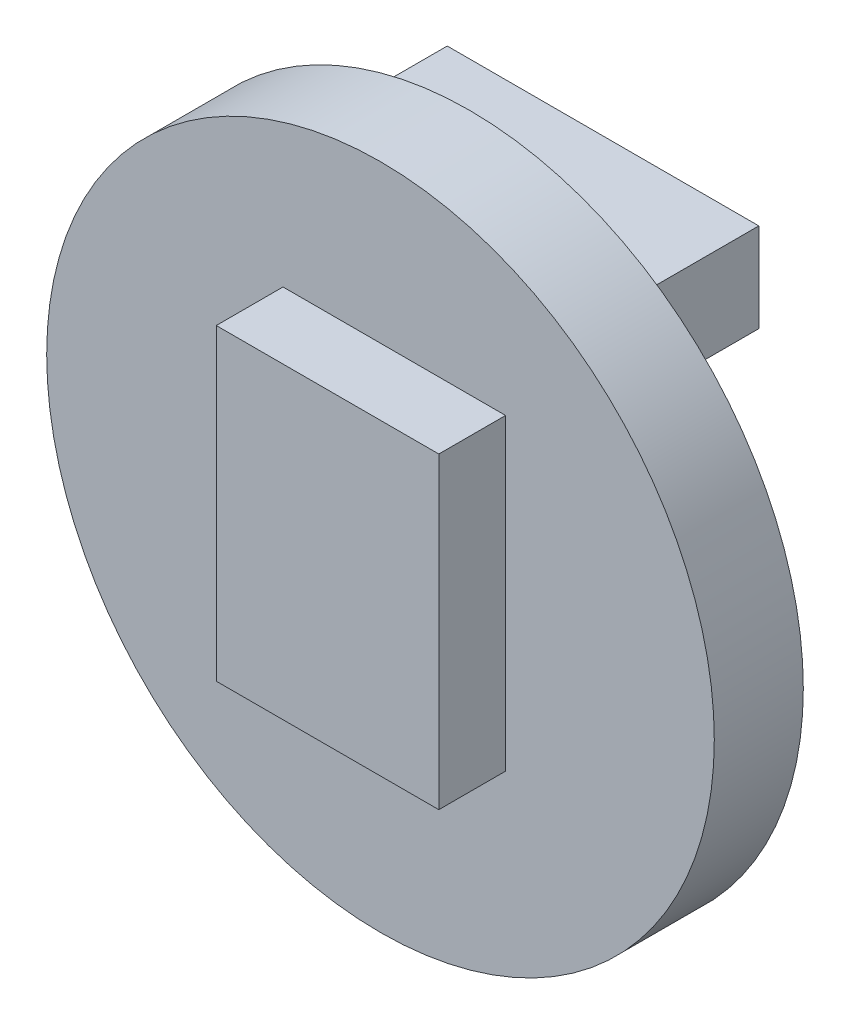
ISO-10303-21;
HEADER;
FILE_DESCRIPTION(('STEP AP214'),'2;1');
FILE_NAME('part.step','',(''),(''),'','','');
FILE_SCHEMA(('AUTOMOTIVE_DESIGN { 1 0 10303 214 1 1 1 1 }'));
ENDSEC;
DATA;
#1=APPLICATION_CONTEXT('core data for automotive mechanical design processes');
#2=APPLICATION_PROTOCOL_DEFINITION('international standard','automotive_design',2000,#1);
#3=PRODUCT_CONTEXT('',#1,'mechanical');
#4=PRODUCT('Part','Part','',(#3));
#5=PRODUCT_RELATED_PRODUCT_CATEGORY('part','',(#4));
#6=PRODUCT_DEFINITION_FORMATION('','',#4);
#7=PRODUCT_DEFINITION_CONTEXT('part definition',#1,'design');
#8=PRODUCT_DEFINITION('design','',#6,#7);
#9=PRODUCT_DEFINITION_SHAPE('','',#8);
#10=(LENGTH_UNIT() NAMED_UNIT(*) SI_UNIT(.MILLI.,.METRE.));
#11=(NAMED_UNIT(*) PLANE_ANGLE_UNIT() SI_UNIT($,.RADIAN.));
#12=(NAMED_UNIT(*) SI_UNIT($,.STERADIAN.) SOLID_ANGLE_UNIT());
#13=UNCERTAINTY_MEASURE_WITH_UNIT(LENGTH_MEASURE(1.E-05),#10,'distance_accuracy_value','');
#14=(GEOMETRIC_REPRESENTATION_CONTEXT(3) GLOBAL_UNCERTAINTY_ASSIGNED_CONTEXT((#13)) GLOBAL_UNIT_ASSIGNED_CONTEXT((#10,
#11,#12)) REPRESENTATION_CONTEXT('',''));
#15=CARTESIAN_POINT('',(0.,0.,0.));
#16=DIRECTION('',(0.,0.,1.));
#17=DIRECTION('',(1.,0.,0.));
#18=AXIS2_PLACEMENT_3D('',#15,#16,#17);
#19=CARTESIAN_POINT('',(0.,0.,0.));
#20=DIRECTION('',(0.,0.,1.));
#21=DIRECTION('',(1.,0.,0.));
#22=AXIS2_PLACEMENT_3D('',#19,#20,#21);
#23=PLANE('',#22);
#24=CARTESIAN_POINT('',(0.,0.,0.));
#25=DIRECTION('',(0.,0.,1.));
#26=DIRECTION('',(1.,0.,0.));
#27=AXIS2_PLACEMENT_3D('',#24,#25,#26);
#28=CIRCLE('',#27,7.5);
#29=CARTESIAN_POINT('',(7.5,0.,0.));
#30=VERTEX_POINT('',#29);
#31=EDGE_CURVE('E35',#30,#30,#28,.T.);
#32=ORIENTED_EDGE('',*,*,#31,.F.);
#33=EDGE_LOOP('',(#32));
#34=FACE_BOUND('',#33,.T.);
#35=DIRECTION('',(0.,1.,0.));
#36=VECTOR('',#35,1.);
#37=CARTESIAN_POINT('',(-3.5,5.5,0.));
#38=LINE('',#37,#36);
#39=CARTESIAN_POINT('',(-3.5,3.5,0.));
#40=VERTEX_POINT('',#39);
#41=CARTESIAN_POINT('',(-3.5,5.5,0.));
#42=VERTEX_POINT('',#41);
#43=EDGE_CURVE('E116',#40,#42,#38,.T.);
#44=ORIENTED_EDGE('',*,*,#43,.F.);
#45=DIRECTION('',(-1.,0.,0.));
#46=VECTOR('',#45,1.);
#47=CARTESIAN_POINT('',(3.5,3.5,0.));
#48=LINE('',#47,#46);
#49=CARTESIAN_POINT('',(3.5,3.5,0.));
#50=VERTEX_POINT('',#49);
#51=EDGE_CURVE('E113',#50,#40,#48,.T.);
#52=ORIENTED_EDGE('',*,*,#51,.F.);
#53=DIRECTION('',(0.,-1.,0.));
#54=VECTOR('',#53,1.);
#55=CARTESIAN_POINT('',(3.5,5.5,0.));
#56=LINE('',#55,#54);
#57=CARTESIAN_POINT('',(3.5,5.5,0.));
#58=VERTEX_POINT('',#57);
#59=EDGE_CURVE('E51',#58,#50,#56,.T.);
#60=ORIENTED_EDGE('',*,*,#59,.F.);
#61=DIRECTION('',(1.,0.,0.));
#62=VECTOR('',#61,1.);
#63=CARTESIAN_POINT('',(3.5,5.5,0.));
#64=LINE('',#63,#62);
#65=EDGE_CURVE('E46',#42,#58,#64,.T.);
#66=ORIENTED_EDGE('',*,*,#65,.F.);
#67=EDGE_LOOP('',(#44,#52,#60,#66));
#68=FACE_BOUND('',#67,.T.);
#69=ADVANCED_FACE('F31',(#34,#68),#23,.F.);
#70=CARTESIAN_POINT('',(0.,0.,2.));
#71=DIRECTION('',(0.,0.,1.));
#72=DIRECTION('',(1.,0.,0.));
#73=AXIS2_PLACEMENT_3D('',#70,#71,#72);
#74=PLANE('',#73);
#75=CARTESIAN_POINT('',(0.,0.,2.));
#76=DIRECTION('',(0.,0.,1.));
#77=DIRECTION('',(1.,0.,0.));
#78=AXIS2_PLACEMENT_3D('',#75,#76,#77);
#79=CIRCLE('',#78,7.5);
#80=CARTESIAN_POINT('',(7.5,0.,2.));
#81=VERTEX_POINT('',#80);
#82=EDGE_CURVE('E11',#81,#81,#79,.T.);
#83=ORIENTED_EDGE('',*,*,#82,.T.);
#84=EDGE_LOOP('',(#83));
#85=FACE_BOUND('',#84,.T.);
#86=DIRECTION('',(-1.,0.,0.));
#87=VECTOR('',#86,1.);
#88=CARTESIAN_POINT('',(-2.1897618838112,3.96647103969272,2.));
#89=LINE('',#88,#87);
#90=CARTESIAN_POINT('',(2.8102381161888,3.96647103969272,2.));
#91=VERTEX_POINT('',#90);
#92=CARTESIAN_POINT('',(-2.1897618838112,3.96647103969272,2.));
#93=VERTEX_POINT('',#92);
#94=EDGE_CURVE('E120',#91,#93,#89,.T.);
#95=ORIENTED_EDGE('',*,*,#94,.F.);
#96=DIRECTION('',(0.,1.,0.));
#97=VECTOR('',#96,1.);
#98=CARTESIAN_POINT('',(2.8102381161888,3.96647103969272,2.));
#99=LINE('',#98,#97);
#100=CARTESIAN_POINT('',(2.8102381161888,-2.95428590822766,2.));
#101=VERTEX_POINT('',#100);
#102=EDGE_CURVE('E117',#101,#91,#99,.T.);
#103=ORIENTED_EDGE('',*,*,#102,.F.);
#104=DIRECTION('',(1.,0.,0.));
#105=VECTOR('',#104,1.);
#106=CARTESIAN_POINT('',(-2.1897618838112,-2.95428590822766,2.));
#107=LINE('',#106,#105);
#108=CARTESIAN_POINT('',(-2.1897618838112,-2.95428590822766,2.));
#109=VERTEX_POINT('',#108);
#110=EDGE_CURVE('E130',#109,#101,#107,.T.);
#111=ORIENTED_EDGE('',*,*,#110,.F.);
#112=DIRECTION('',(0.,-1.,0.));
#113=VECTOR('',#112,1.);
#114=CARTESIAN_POINT('',(-2.1897618838112,3.96647103969272,2.));
#115=LINE('',#114,#113);
#116=EDGE_CURVE('E138',#93,#109,#115,.T.);
#117=ORIENTED_EDGE('',*,*,#116,.F.);
#118=EDGE_LOOP('',(#95,#103,#111,#117));
#119=FACE_BOUND('',#118,.T.);
#120=ADVANCED_FACE('F157',(#85,#119),#74,.T.);
#121=CARTESIAN_POINT('',(0.,0.,2.));
#122=DIRECTION('',(0.,0.,-1.));
#123=DIRECTION('',(-1.,0.,0.));
#124=AXIS2_PLACEMENT_3D('',#121,#122,#123);
#125=CYLINDRICAL_SURFACE('',#124,7.5);
#126=ORIENTED_EDGE('',*,*,#82,.F.);
#127=EDGE_LOOP('',(#126));
#128=FACE_BOUND('',#127,.T.);
#129=ORIENTED_EDGE('',*,*,#31,.T.);
#130=EDGE_LOOP('',(#129));
#131=FACE_BOUND('',#130,.T.);
#132=ADVANCED_FACE('F33',(#128,#131),#125,.T.);
#133=CARTESIAN_POINT('',(2.8102381161888,3.96647103969272,3.5));
#134=DIRECTION('',(-1.,0.,0.));
#135=DIRECTION('',(0.,0.,1.));
#136=AXIS2_PLACEMENT_3D('',#133,#134,#135);
#137=PLANE('',#136);
#138=ORIENTED_EDGE('',*,*,#102,.T.);
#139=DIRECTION('',(0.,0.,-1.));
#140=VECTOR('',#139,1.);
#141=CARTESIAN_POINT('',(2.8102381161888,3.96647103969272,3.5));
#142=LINE('',#141,#140);
#143=CARTESIAN_POINT('',(2.8102381161888,3.96647103969272,3.5));
#144=VERTEX_POINT('',#143);
#145=EDGE_CURVE('E149',#144,#91,#142,.T.);
#146=ORIENTED_EDGE('',*,*,#145,.F.);
#147=DIRECTION('',(0.,1.,0.));
#148=VECTOR('',#147,1.);
#149=CARTESIAN_POINT('',(2.8102381161888,3.96647103969272,3.5));
#150=LINE('',#149,#148);
#151=CARTESIAN_POINT('',(2.8102381161888,-2.95428590822766,3.5));
#152=VERTEX_POINT('',#151);
#153=EDGE_CURVE('E126',#152,#144,#150,.T.);
#154=ORIENTED_EDGE('',*,*,#153,.F.);
#155=DIRECTION('',(0.,0.,-1.));
#156=VECTOR('',#155,1.);
#157=CARTESIAN_POINT('',(2.8102381161888,-2.95428590822766,3.5));
#158=LINE('',#157,#156);
#159=EDGE_CURVE('E135',#152,#101,#158,.T.);
#160=ORIENTED_EDGE('',*,*,#159,.T.);
#161=EDGE_LOOP('',(#138,#146,#154,#160));
#162=FACE_BOUND('',#161,.T.);
#163=ADVANCED_FACE('F200',(#162),#137,.F.);
#164=CARTESIAN_POINT('',(-2.1897618838112,3.96647103969272,3.5));
#165=DIRECTION('',(0.,-1.,0.));
#166=DIRECTION('',(0.,0.,-1.));
#167=AXIS2_PLACEMENT_3D('',#164,#165,#166);
#168=PLANE('',#167);
#169=ORIENTED_EDGE('',*,*,#94,.T.);
#170=DIRECTION('',(0.,0.,-1.));
#171=VECTOR('',#170,1.);
#172=CARTESIAN_POINT('',(-2.1897618838112,3.96647103969272,3.5));
#173=LINE('',#172,#171);
#174=CARTESIAN_POINT('',(-2.1897618838112,3.96647103969272,3.5));
#175=VERTEX_POINT('',#174);
#176=EDGE_CURVE('E146',#175,#93,#173,.T.);
#177=ORIENTED_EDGE('',*,*,#176,.F.);
#178=DIRECTION('',(-1.,0.,0.));
#179=VECTOR('',#178,1.);
#180=CARTESIAN_POINT('',(-2.1897618838112,3.96647103969272,3.5));
#181=LINE('',#180,#179);
#182=EDGE_CURVE('E129',#144,#175,#181,.T.);
#183=ORIENTED_EDGE('',*,*,#182,.F.);
#184=ORIENTED_EDGE('',*,*,#145,.T.);
#185=EDGE_LOOP('',(#169,#177,#183,#184));
#186=FACE_BOUND('',#185,.T.);
#187=ADVANCED_FACE('F196',(#186),#168,.F.);
#188=CARTESIAN_POINT('',(-2.1897618838112,3.96647103969272,3.5));
#189=DIRECTION('',(1.,0.,0.));
#190=DIRECTION('',(0.,1.,0.));
#191=AXIS2_PLACEMENT_3D('',#188,#189,#190);
#192=PLANE('',#191);
#193=ORIENTED_EDGE('',*,*,#116,.T.);
#194=DIRECTION('',(0.,0.,-1.));
#195=VECTOR('',#194,1.);
#196=CARTESIAN_POINT('',(-2.1897618838112,-2.95428590822766,3.5));
#197=LINE('',#196,#195);
#198=CARTESIAN_POINT('',(-2.1897618838112,-2.95428590822766,3.5));
#199=VERTEX_POINT('',#198);
#200=EDGE_CURVE('E144',#199,#109,#197,.T.);
#201=ORIENTED_EDGE('',*,*,#200,.F.);
#202=DIRECTION('',(0.,-1.,0.));
#203=VECTOR('',#202,1.);
#204=CARTESIAN_POINT('',(-2.1897618838112,3.96647103969272,3.5));
#205=LINE('',#204,#203);
#206=EDGE_CURVE('E132',#175,#199,#205,.T.);
#207=ORIENTED_EDGE('',*,*,#206,.F.);
#208=ORIENTED_EDGE('',*,*,#176,.T.);
#209=EDGE_LOOP('',(#193,#201,#207,#208));
#210=FACE_BOUND('',#209,.T.);
#211=ADVANCED_FACE('F192',(#210),#192,.F.);
#212=CARTESIAN_POINT('',(-2.1897618838112,-2.95428590822766,3.5));
#213=DIRECTION('',(0.,1.,0.));
#214=DIRECTION('',(0.,0.,1.));
#215=AXIS2_PLACEMENT_3D('',#212,#213,#214);
#216=PLANE('',#215);
#217=ORIENTED_EDGE('',*,*,#110,.T.);
#218=ORIENTED_EDGE('',*,*,#159,.F.);
#219=DIRECTION('',(1.,0.,0.));
#220=VECTOR('',#219,1.);
#221=CARTESIAN_POINT('',(-2.1897618838112,-2.95428590822766,3.5));
#222=LINE('',#221,#220);
#223=EDGE_CURVE('E134',#199,#152,#222,.T.);
#224=ORIENTED_EDGE('',*,*,#223,.F.);
#225=ORIENTED_EDGE('',*,*,#200,.T.);
#226=EDGE_LOOP('',(#217,#218,#224,#225));
#227=FACE_BOUND('',#226,.T.);
#228=ADVANCED_FACE('F188',(#227),#216,.F.);
#229=CARTESIAN_POINT('',(2.8102381161888,-2.95428590822766,3.5));
#230=DIRECTION('',(0.,0.,1.));
#231=DIRECTION('',(1.,0.,0.));
#232=AXIS2_PLACEMENT_3D('',#229,#230,#231);
#233=PLANE('',#232);
#234=ORIENTED_EDGE('',*,*,#153,.T.);
#235=ORIENTED_EDGE('',*,*,#182,.T.);
#236=ORIENTED_EDGE('',*,*,#206,.T.);
#237=ORIENTED_EDGE('',*,*,#223,.T.);
#238=EDGE_LOOP('',(#234,#235,#236,#237));
#239=FACE_BOUND('',#238,.T.);
#240=ADVANCED_FACE('F185',(#239),#233,.T.);
#241=CARTESIAN_POINT('',(-3.5,5.5,-3.));
#242=DIRECTION('',(1.,0.,0.));
#243=DIRECTION('',(0.,1.,0.));
#244=AXIS2_PLACEMENT_3D('',#241,#242,#243);
#245=PLANE('',#244);
#246=ORIENTED_EDGE('',*,*,#43,.T.);
#247=DIRECTION('',(0.,0.,1.));
#248=VECTOR('',#247,1.);
#249=CARTESIAN_POINT('',(-3.5,5.5,-3.));
#250=LINE('',#249,#248);
#251=CARTESIAN_POINT('',(-3.5,5.5,-3.));
#252=VERTEX_POINT('',#251);
#253=EDGE_CURVE('E97',#252,#42,#250,.T.);
#254=ORIENTED_EDGE('',*,*,#253,.F.);
#255=DIRECTION('',(0.,1.,0.));
#256=VECTOR('',#255,1.);
#257=CARTESIAN_POINT('',(-3.5,5.5,-3.));
#258=LINE('',#257,#256);
#259=CARTESIAN_POINT('',(-3.5,3.5,-3.));
#260=VERTEX_POINT('',#259);
#261=EDGE_CURVE('E104',#260,#252,#258,.T.);
#262=ORIENTED_EDGE('',*,*,#261,.F.);
#263=DIRECTION('',(0.,0.,1.));
#264=VECTOR('',#263,1.);
#265=CARTESIAN_POINT('',(-3.5,3.5,-3.));
#266=LINE('',#265,#264);
#267=EDGE_CURVE('E163',#260,#40,#266,.T.);
#268=ORIENTED_EDGE('',*,*,#267,.T.);
#269=EDGE_LOOP('',(#246,#254,#262,#268));
#270=FACE_BOUND('',#269,.T.);
#271=ADVANCED_FACE('F115',(#270),#245,.F.);
#272=CARTESIAN_POINT('',(3.5,5.5,-3.));
#273=DIRECTION('',(0.,-1.,0.));
#274=DIRECTION('',(0.,0.,-1.));
#275=AXIS2_PLACEMENT_3D('',#272,#273,#274);
#276=PLANE('',#275);
#277=ORIENTED_EDGE('',*,*,#65,.T.);
#278=DIRECTION('',(0.,0.,1.));
#279=VECTOR('',#278,1.);
#280=CARTESIAN_POINT('',(3.5,5.5,-3.));
#281=LINE('',#280,#279);
#282=CARTESIAN_POINT('',(3.5,5.5,-3.));
#283=VERTEX_POINT('',#282);
#284=EDGE_CURVE('E100',#283,#58,#281,.T.);
#285=ORIENTED_EDGE('',*,*,#284,.F.);
#286=DIRECTION('',(1.,0.,0.));
#287=VECTOR('',#286,1.);
#288=CARTESIAN_POINT('',(3.5,5.5,-3.));
#289=LINE('',#288,#287);
#290=EDGE_CURVE('E93',#252,#283,#289,.T.);
#291=ORIENTED_EDGE('',*,*,#290,.F.);
#292=ORIENTED_EDGE('',*,*,#253,.T.);
#293=EDGE_LOOP('',(#277,#285,#291,#292));
#294=FACE_BOUND('',#293,.T.);
#295=ADVANCED_FACE('F95',(#294),#276,.F.);
#296=CARTESIAN_POINT('',(3.5,5.5,-3.));
#297=DIRECTION('',(-1.,0.,0.));
#298=DIRECTION('',(0.,-1.,0.));
#299=AXIS2_PLACEMENT_3D('',#296,#297,#298);
#300=PLANE('',#299);
#301=ORIENTED_EDGE('',*,*,#59,.T.);
#302=DIRECTION('',(0.,0.,1.));
#303=VECTOR('',#302,1.);
#304=CARTESIAN_POINT('',(3.5,3.5,-3.));
#305=LINE('',#304,#303);
#306=CARTESIAN_POINT('',(3.5,3.5,-3.));
#307=VERTEX_POINT('',#306);
#308=EDGE_CURVE('E122',#307,#50,#305,.T.);
#309=ORIENTED_EDGE('',*,*,#308,.F.);
#310=DIRECTION('',(0.,-1.,0.));
#311=VECTOR('',#310,1.);
#312=CARTESIAN_POINT('',(3.5,5.5,-3.));
#313=LINE('',#312,#311);
#314=EDGE_CURVE('E103',#283,#307,#313,.T.);
#315=ORIENTED_EDGE('',*,*,#314,.F.);
#316=ORIENTED_EDGE('',*,*,#284,.T.);
#317=EDGE_LOOP('',(#301,#309,#315,#316));
#318=FACE_BOUND('',#317,.T.);
#319=ADVANCED_FACE('F172',(#318),#300,.F.);
#320=CARTESIAN_POINT('',(3.5,3.5,-3.));
#321=DIRECTION('',(0.,1.,0.));
#322=DIRECTION('',(0.,0.,1.));
#323=AXIS2_PLACEMENT_3D('',#320,#321,#322);
#324=PLANE('',#323);
#325=ORIENTED_EDGE('',*,*,#51,.T.);
#326=ORIENTED_EDGE('',*,*,#267,.F.);
#327=DIRECTION('',(-1.,0.,0.));
#328=VECTOR('',#327,1.);
#329=CARTESIAN_POINT('',(3.5,3.5,-3.));
#330=LINE('',#329,#328);
#331=EDGE_CURVE('E109',#307,#260,#330,.T.);
#332=ORIENTED_EDGE('',*,*,#331,.F.);
#333=ORIENTED_EDGE('',*,*,#308,.T.);
#334=EDGE_LOOP('',(#325,#326,#332,#333));
#335=FACE_BOUND('',#334,.T.);
#336=ADVANCED_FACE('F162',(#335),#324,.F.);
#337=CARTESIAN_POINT('',(-3.5,3.5,-3.));
#338=DIRECTION('',(0.,0.,-1.));
#339=DIRECTION('',(-1.,0.,0.));
#340=AXIS2_PLACEMENT_3D('',#337,#338,#339);
#341=PLANE('',#340);
#342=ORIENTED_EDGE('',*,*,#261,.T.);
#343=ORIENTED_EDGE('',*,*,#290,.T.);
#344=ORIENTED_EDGE('',*,*,#314,.T.);
#345=ORIENTED_EDGE('',*,*,#331,.T.);
#346=EDGE_LOOP('',(#342,#343,#344,#345));
#347=FACE_BOUND('',#346,.T.);
#348=ADVANCED_FACE('F107',(#347),#341,.T.);
#349=CLOSED_SHELL('',(#69,#120,#132,#163,#187,#211,#228,#240,#271,#295,#319,#336,#348));
#350=MANIFOLD_SOLID_BREP('B2',#349);
#351=ADVANCED_BREP_SHAPE_REPRESENTATION('',(#18,#350),#14);
#352=SHAPE_DEFINITION_REPRESENTATION(#9,#351);
ENDSEC;
END-ISO-10303-21;
